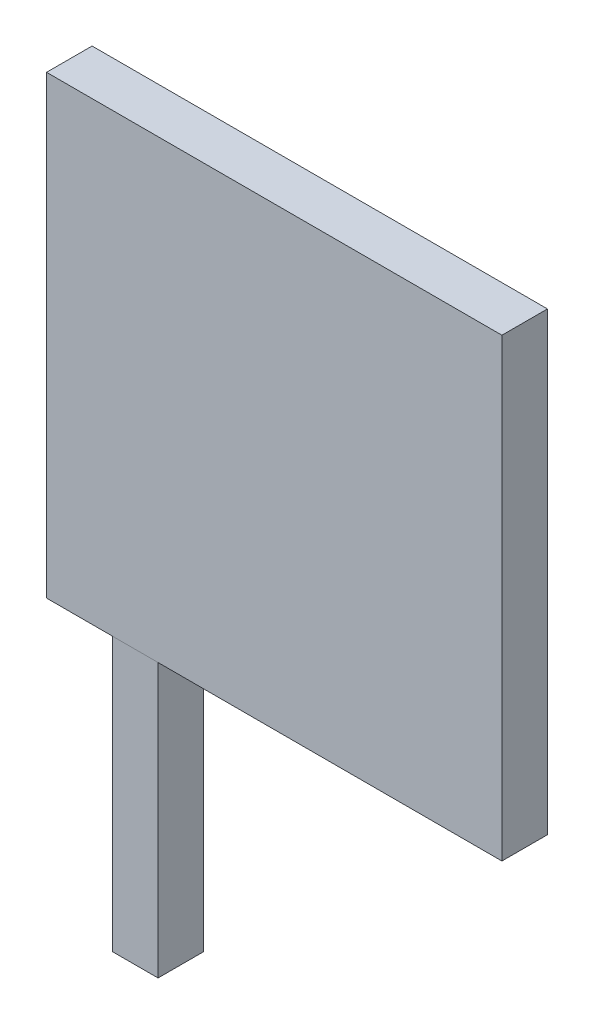
ISO-10303-21;
HEADER;
FILE_DESCRIPTION(('STEP AP214'),'2;1');
FILE_NAME('part.step','',(''),(''),'','','');
FILE_SCHEMA(('AUTOMOTIVE_DESIGN { 1 0 10303 214 1 1 1 1 }'));
ENDSEC;
DATA;
#1=APPLICATION_CONTEXT('core data for automotive mechanical design processes');
#2=APPLICATION_PROTOCOL_DEFINITION('international standard','automotive_design',2000,#1);
#3=PRODUCT_CONTEXT('',#1,'mechanical');
#4=PRODUCT('Part','Part','',(#3));
#5=PRODUCT_RELATED_PRODUCT_CATEGORY('part','',(#4));
#6=PRODUCT_DEFINITION_FORMATION('','',#4);
#7=PRODUCT_DEFINITION_CONTEXT('part definition',#1,'design');
#8=PRODUCT_DEFINITION('design','',#6,#7);
#9=PRODUCT_DEFINITION_SHAPE('','',#8);
#10=(LENGTH_UNIT() NAMED_UNIT(*) SI_UNIT(.MILLI.,.METRE.));
#11=(NAMED_UNIT(*) PLANE_ANGLE_UNIT() SI_UNIT($,.RADIAN.));
#12=(NAMED_UNIT(*) SI_UNIT($,.STERADIAN.) SOLID_ANGLE_UNIT());
#13=UNCERTAINTY_MEASURE_WITH_UNIT(LENGTH_MEASURE(1.E-05),#10,'distance_accuracy_value','');
#14=(GEOMETRIC_REPRESENTATION_CONTEXT(3) GLOBAL_UNCERTAINTY_ASSIGNED_CONTEXT((#13)) GLOBAL_UNIT_ASSIGNED_CONTEXT((#10,
#11,#12)) REPRESENTATION_CONTEXT('',''));
#15=CARTESIAN_POINT('',(0.,0.,0.));
#16=DIRECTION('',(0.,0.,1.));
#17=DIRECTION('',(1.,0.,0.));
#18=AXIS2_PLACEMENT_3D('',#15,#16,#17);
#19=CARTESIAN_POINT('',(-3.5868313545061,-10.4999999999969,0.268683274017871));
#20=DIRECTION('',(1.,0.,0.));
#21=DIRECTION('',(0.,1.,0.));
#22=AXIS2_PLACEMENT_3D('',#19,#20,#21);
#23=PLANE('',#22);
#24=DIRECTION('',(0.,0.,-1.));
#25=VECTOR('',#24,1.);
#26=CARTESIAN_POINT('',(-3.5868313545061,-4.49999999999686,0.268683274017892));
#27=LINE('',#26,#25);
#28=CARTESIAN_POINT('',(-3.5868313545061,-4.49999999999686,0.268683274017892));
#29=VERTEX_POINT('',#28);
#30=CARTESIAN_POINT('',(-3.5868313545061,-4.49999999999685,-0.731316725982108));
#31=VERTEX_POINT('',#30);
#32=EDGE_CURVE('E106',#29,#31,#27,.T.);
#33=ORIENTED_EDGE('',*,*,#32,.T.);
#34=DIRECTION('',(0.,1.,0.));
#35=VECTOR('',#34,1.);
#36=CARTESIAN_POINT('',(-3.5868313545061,-10.4999999999969,-0.731316725982129));
#37=LINE('',#36,#35);
#38=CARTESIAN_POINT('',(-3.5868313545061,-10.4999999999969,-0.731316725982129));
#39=VERTEX_POINT('',#38);
#40=EDGE_CURVE('E12',#39,#31,#37,.T.);
#41=ORIENTED_EDGE('',*,*,#40,.F.);
#42=DIRECTION('',(0.,0.,-1.));
#43=VECTOR('',#42,1.);
#44=CARTESIAN_POINT('',(-3.5868313545061,-10.4999999999969,0.268683274017871));
#45=LINE('',#44,#43);
#46=CARTESIAN_POINT('',(-3.5868313545061,-10.4999999999969,0.268683274017871));
#47=VERTEX_POINT('',#46);
#48=EDGE_CURVE('E94',#47,#39,#45,.T.);
#49=ORIENTED_EDGE('',*,*,#48,.F.);
#50=DIRECTION('',(0.,1.,0.));
#51=VECTOR('',#50,1.);
#52=CARTESIAN_POINT('',(-3.5868313545061,-10.4999999999969,0.268683274017871));
#53=LINE('',#52,#51);
#54=EDGE_CURVE('E102',#47,#29,#53,.T.);
#55=ORIENTED_EDGE('',*,*,#54,.T.);
#56=EDGE_LOOP('',(#33,#41,#49,#55));
#57=FACE_BOUND('',#56,.T.);
#58=ADVANCED_FACE('F43',(#57),#23,.F.);
#59=CARTESIAN_POINT('',(-3.5868313545061,-10.4999999999969,-0.731316725982129));
#60=DIRECTION('',(0.,0.,1.));
#61=DIRECTION('',(0.,-1.,0.));
#62=AXIS2_PLACEMENT_3D('',#59,#60,#61);
#63=PLANE('',#62);
#64=DIRECTION('',(1.,0.,0.));
#65=VECTOR('',#64,1.);
#66=CARTESIAN_POINT('',(-3.5868313545061,-4.49999999999685,-0.731316725982108));
#67=LINE('',#66,#65);
#68=CARTESIAN_POINT('',(-2.5868313545061,-4.49999999999685,-0.731316725982108));
#69=VERTEX_POINT('',#68);
#70=EDGE_CURVE('E98',#31,#69,#67,.T.);
#71=ORIENTED_EDGE('',*,*,#70,.T.);
#72=DIRECTION('',(0.,1.,0.));
#73=VECTOR('',#72,1.);
#74=CARTESIAN_POINT('',(-2.5868313545061,-10.4999999999969,-0.731316725982129));
#75=LINE('',#74,#73);
#76=CARTESIAN_POINT('',(-2.5868313545061,-10.4999999999969,-0.731316725982129));
#77=VERTEX_POINT('',#76);
#78=EDGE_CURVE('E51',#77,#69,#75,.T.);
#79=ORIENTED_EDGE('',*,*,#78,.F.);
#80=DIRECTION('',(1.,0.,0.));
#81=VECTOR('',#80,1.);
#82=CARTESIAN_POINT('',(-3.5868313545061,-10.4999999999969,-0.731316725982129));
#83=LINE('',#82,#81);
#84=EDGE_CURVE('E89',#39,#77,#83,.T.);
#85=ORIENTED_EDGE('',*,*,#84,.F.);
#86=ORIENTED_EDGE('',*,*,#40,.T.);
#87=EDGE_LOOP('',(#71,#79,#85,#86));
#88=FACE_BOUND('',#87,.T.);
#89=ADVANCED_FACE('F97',(#88),#63,.F.);
#90=CARTESIAN_POINT('',(-2.5868313545061,-10.4999999999969,0.268683274017871));
#91=DIRECTION('',(-1.,0.,0.));
#92=DIRECTION('',(0.,-1.,0.));
#93=AXIS2_PLACEMENT_3D('',#90,#91,#92);
#94=PLANE('',#93);
#95=DIRECTION('',(0.,0.,1.));
#96=VECTOR('',#95,1.);
#97=CARTESIAN_POINT('',(-2.5868313545061,-4.49999999999686,0.268683274017892));
#98=LINE('',#97,#96);
#99=CARTESIAN_POINT('',(-2.5868313545061,-4.49999999999686,0.268683274017892));
#100=VERTEX_POINT('',#99);
#101=EDGE_CURVE('E76',#69,#100,#98,.T.);
#102=ORIENTED_EDGE('',*,*,#101,.T.);
#103=DIRECTION('',(0.,1.,0.));
#104=VECTOR('',#103,1.);
#105=CARTESIAN_POINT('',(-2.5868313545061,-10.4999999999969,0.268683274017871));
#106=LINE('',#105,#104);
#107=CARTESIAN_POINT('',(-2.5868313545061,-10.4999999999969,0.268683274017871));
#108=VERTEX_POINT('',#107);
#109=EDGE_CURVE('E99',#108,#100,#106,.T.);
#110=ORIENTED_EDGE('',*,*,#109,.F.);
#111=DIRECTION('',(0.,0.,1.));
#112=VECTOR('',#111,1.);
#113=CARTESIAN_POINT('',(-2.5868313545061,-10.4999999999969,0.268683274017871));
#114=LINE('',#113,#112);
#115=EDGE_CURVE('E92',#77,#108,#114,.T.);
#116=ORIENTED_EDGE('',*,*,#115,.F.);
#117=ORIENTED_EDGE('',*,*,#78,.T.);
#118=EDGE_LOOP('',(#102,#110,#116,#117));
#119=FACE_BOUND('',#118,.T.);
#120=ADVANCED_FACE('F100',(#119),#94,.F.);
#121=CARTESIAN_POINT('',(-3.5868313545061,-10.4999999999969,0.268683274017871));
#122=DIRECTION('',(0.,0.,-1.));
#123=DIRECTION('',(0.,1.,0.));
#124=AXIS2_PLACEMENT_3D('',#121,#122,#123);
#125=PLANE('',#124);
#126=DIRECTION('',(-1.,0.,0.));
#127=VECTOR('',#126,1.);
#128=CARTESIAN_POINT('',(-3.5868313545061,-4.49999999999686,0.268683274017892));
#129=LINE('',#128,#127);
#130=EDGE_CURVE('E82',#100,#29,#129,.T.);
#131=ORIENTED_EDGE('',*,*,#130,.T.);
#132=ORIENTED_EDGE('',*,*,#54,.F.);
#133=DIRECTION('',(-1.,0.,0.));
#134=VECTOR('',#133,1.);
#135=CARTESIAN_POINT('',(-3.5868313545061,-10.4999999999969,0.268683274017871));
#136=LINE('',#135,#134);
#137=EDGE_CURVE('E59',#108,#47,#136,.T.);
#138=ORIENTED_EDGE('',*,*,#137,.F.);
#139=ORIENTED_EDGE('',*,*,#109,.T.);
#140=EDGE_LOOP('',(#131,#132,#138,#139));
#141=FACE_BOUND('',#140,.T.);
#142=ADVANCED_FACE('F113',(#141),#125,.F.);
#143=CARTESIAN_POINT('',(0.,-10.4999999999969,-0.731316725982129));
#144=DIRECTION('',(0.,-1.,0.));
#145=DIRECTION('',(1.,0.,0.));
#146=AXIS2_PLACEMENT_3D('',#143,#144,#145);
#147=PLANE('',#146);
#148=ORIENTED_EDGE('',*,*,#48,.T.);
#149=ORIENTED_EDGE('',*,*,#84,.T.);
#150=ORIENTED_EDGE('',*,*,#115,.T.);
#151=ORIENTED_EDGE('',*,*,#137,.T.);
#152=EDGE_LOOP('',(#148,#149,#150,#151));
#153=FACE_BOUND('',#152,.T.);
#154=ADVANCED_FACE('F90',(#153),#147,.T.);
#155=CARTESIAN_POINT('',(0.,-4.49999999999685,-0.731316725982108));
#156=DIRECTION('',(0.,-1.,0.));
#157=DIRECTION('',(1.,0.,0.));
#158=AXIS2_PLACEMENT_3D('',#155,#156,#157);
#159=PLANE('',#158);
#160=ORIENTED_EDGE('',*,*,#32,.F.);
#161=ORIENTED_EDGE('',*,*,#130,.F.);
#162=ORIENTED_EDGE('',*,*,#101,.F.);
#163=ORIENTED_EDGE('',*,*,#70,.F.);
#164=EDGE_LOOP('',(#160,#161,#162,#163));
#165=FACE_BOUND('',#164,.T.);
#166=ADVANCED_FACE('F116',(#165),#159,.F.);
#167=CLOSED_SHELL('',(#58,#89,#120,#142,#154,#166));
#168=MANIFOLD_SOLID_BREP('B2',#167);
#169=CARTESIAN_POINT('',(-5.0355871886121,5.4999999999998,0.268683274023395));
#170=DIRECTION('',(1.,0.,0.));
#171=DIRECTION('',(0.,1.,4.08506561910826E-13));
#172=AXIS2_PLACEMENT_3D('',#169,#170,#171);
#173=PLANE('',#172);
#174=DIRECTION('',(0.,-1.,-4.08506561910826E-13));
#175=VECTOR('',#174,1.);
#176=CARTESIAN_POINT('',(-5.0355871886121,5.50000000000021,-0.731316725976605));
#177=LINE('',#176,#175);
#178=CARTESIAN_POINT('',(-5.0355871886121,5.50000000000021,-0.731316725976605));
#179=VERTEX_POINT('',#178);
#180=CARTESIAN_POINT('',(-5.0355871886121,-4.4999999999998,-0.73131672598069));
#181=VERTEX_POINT('',#180);
#182=EDGE_CURVE('E229',#179,#181,#177,.T.);
#183=ORIENTED_EDGE('',*,*,#182,.T.);
#184=DIRECTION('',(0.,4.08506561910826E-13,-1.));
#185=VECTOR('',#184,1.);
#186=CARTESIAN_POINT('',(-5.0355871886121,-4.50000000000021,0.26868327401931));
#187=LINE('',#186,#185);
#188=CARTESIAN_POINT('',(-5.0355871886121,-4.50000000000021,0.26868327401931));
#189=VERTEX_POINT('',#188);
#190=EDGE_CURVE('E41',#189,#181,#187,.T.);
#191=ORIENTED_EDGE('',*,*,#190,.F.);
#192=DIRECTION('',(0.,-1.,-4.08506561910826E-13));
#193=VECTOR('',#192,1.);
#194=CARTESIAN_POINT('',(-5.0355871886121,5.4999999999998,0.268683274023395));
#195=LINE('',#194,#193);
#196=CARTESIAN_POINT('',(-5.0355871886121,5.4999999999998,0.268683274023395));
#197=VERTEX_POINT('',#196);
#198=EDGE_CURVE('E217',#197,#189,#195,.T.);
#199=ORIENTED_EDGE('',*,*,#198,.F.);
#200=DIRECTION('',(0.,4.08506561910826E-13,-1.));
#201=VECTOR('',#200,1.);
#202=CARTESIAN_POINT('',(-5.0355871886121,5.4999999999998,0.268683274023395));
#203=LINE('',#202,#201);
#204=EDGE_CURVE('E225',#197,#179,#203,.T.);
#205=ORIENTED_EDGE('',*,*,#204,.T.);
#206=EDGE_LOOP('',(#183,#191,#199,#205));
#207=FACE_BOUND('',#206,.T.);
#208=ADVANCED_FACE('F166',(#207),#173,.F.);
#209=CARTESIAN_POINT('',(-5.0355871886121,-4.50000000000021,0.26868327401931));
#210=DIRECTION('',(0.,1.,4.08506561910826E-13));
#211=DIRECTION('',(-1.,0.,0.));
#212=AXIS2_PLACEMENT_3D('',#209,#210,#211);
#213=PLANE('',#212);
#214=DIRECTION('',(1.,0.,0.));
#215=VECTOR('',#214,1.);
#216=CARTESIAN_POINT('',(-5.0355871886121,-4.4999999999998,-0.73131672598069));
#217=LINE('',#216,#215);
#218=CARTESIAN_POINT('',(4.9644128113879,-4.4999999999998,-0.73131672598069));
#219=VERTEX_POINT('',#218);
#220=EDGE_CURVE('E221',#181,#219,#217,.T.);
#221=ORIENTED_EDGE('',*,*,#220,.T.);
#222=DIRECTION('',(0.,4.08506561910826E-13,-1.));
#223=VECTOR('',#222,1.);
#224=CARTESIAN_POINT('',(4.9644128113879,-4.50000000000021,0.26868327401931));
#225=LINE('',#224,#223);
#226=CARTESIAN_POINT('',(4.9644128113879,-4.50000000000021,0.26868327401931));
#227=VERTEX_POINT('',#226);
#228=EDGE_CURVE('E174',#227,#219,#225,.T.);
#229=ORIENTED_EDGE('',*,*,#228,.F.);
#230=DIRECTION('',(1.,0.,0.));
#231=VECTOR('',#230,1.);
#232=CARTESIAN_POINT('',(-5.0355871886121,-4.50000000000021,0.26868327401931));
#233=LINE('',#232,#231);
#234=EDGE_CURVE('E212',#189,#227,#233,.T.);
#235=ORIENTED_EDGE('',*,*,#234,.F.);
#236=ORIENTED_EDGE('',*,*,#190,.T.);
#237=EDGE_LOOP('',(#221,#229,#235,#236));
#238=FACE_BOUND('',#237,.T.);
#239=ADVANCED_FACE('F220',(#238),#213,.F.);
#240=CARTESIAN_POINT('',(4.9644128113879,5.4999999999998,0.268683274023395));
#241=DIRECTION('',(-1.,0.,0.));
#242=DIRECTION('',(0.,-1.,-4.08506561910826E-13));
#243=AXIS2_PLACEMENT_3D('',#240,#241,#242);
#244=PLANE('',#243);
#245=DIRECTION('',(0.,1.,4.08506561910826E-13));
#246=VECTOR('',#245,1.);
#247=CARTESIAN_POINT('',(4.9644128113879,5.50000000000021,-0.731316725976605));
#248=LINE('',#247,#246);
#249=CARTESIAN_POINT('',(4.9644128113879,5.50000000000021,-0.731316725976605));
#250=VERTEX_POINT('',#249);
#251=EDGE_CURVE('E199',#219,#250,#248,.T.);
#252=ORIENTED_EDGE('',*,*,#251,.T.);
#253=DIRECTION('',(0.,4.08506561910826E-13,-1.));
#254=VECTOR('',#253,1.);
#255=CARTESIAN_POINT('',(4.9644128113879,5.4999999999998,0.268683274023395));
#256=LINE('',#255,#254);
#257=CARTESIAN_POINT('',(4.9644128113879,5.4999999999998,0.268683274023395));
#258=VERTEX_POINT('',#257);
#259=EDGE_CURVE('E222',#258,#250,#256,.T.);
#260=ORIENTED_EDGE('',*,*,#259,.F.);
#261=DIRECTION('',(0.,1.,4.08506561910826E-13));
#262=VECTOR('',#261,1.);
#263=CARTESIAN_POINT('',(4.9644128113879,5.4999999999998,0.268683274023395));
#264=LINE('',#263,#262);
#265=EDGE_CURVE('E215',#227,#258,#264,.T.);
#266=ORIENTED_EDGE('',*,*,#265,.F.);
#267=ORIENTED_EDGE('',*,*,#228,.T.);
#268=EDGE_LOOP('',(#252,#260,#266,#267));
#269=FACE_BOUND('',#268,.T.);
#270=ADVANCED_FACE('F223',(#269),#244,.F.);
#271=CARTESIAN_POINT('',(-5.0355871886121,5.4999999999998,0.268683274023395));
#272=DIRECTION('',(0.,-1.,-4.08506561910826E-13));
#273=DIRECTION('',(1.,0.,0.));
#274=AXIS2_PLACEMENT_3D('',#271,#272,#273);
#275=PLANE('',#274);
#276=DIRECTION('',(-1.,0.,0.));
#277=VECTOR('',#276,1.);
#278=CARTESIAN_POINT('',(-5.0355871886121,5.50000000000021,-0.731316725976605));
#279=LINE('',#278,#277);
#280=EDGE_CURVE('E205',#250,#179,#279,.T.);
#281=ORIENTED_EDGE('',*,*,#280,.T.);
#282=ORIENTED_EDGE('',*,*,#204,.F.);
#283=DIRECTION('',(-1.,0.,0.));
#284=VECTOR('',#283,1.);
#285=CARTESIAN_POINT('',(-5.0355871886121,5.4999999999998,0.268683274023395));
#286=LINE('',#285,#284);
#287=EDGE_CURVE('E182',#258,#197,#286,.T.);
#288=ORIENTED_EDGE('',*,*,#287,.F.);
#289=ORIENTED_EDGE('',*,*,#259,.T.);
#290=EDGE_LOOP('',(#281,#282,#288,#289));
#291=FACE_BOUND('',#290,.T.);
#292=ADVANCED_FACE('F236',(#291),#275,.F.);
#293=CARTESIAN_POINT('',(0.,0.268683274021148,0.268683274021258));
#294=DIRECTION('',(0.,-4.08506561910826E-13,1.));
#295=DIRECTION('',(0.,-1.,-4.08506561910826E-13));
#296=AXIS2_PLACEMENT_3D('',#293,#294,#295);
#297=PLANE('',#296);
#298=ORIENTED_EDGE('',*,*,#198,.T.);
#299=ORIENTED_EDGE('',*,*,#234,.T.);
#300=ORIENTED_EDGE('',*,*,#265,.T.);
#301=ORIENTED_EDGE('',*,*,#287,.T.);
#302=EDGE_LOOP('',(#298,#299,#300,#301));
#303=FACE_BOUND('',#302,.T.);
#304=ADVANCED_FACE('F213',(#303),#297,.T.);
#305=CARTESIAN_POINT('',(0.,0.268683274021557,-0.731316725978742));
#306=DIRECTION('',(0.,-4.08506561910826E-13,1.));
#307=DIRECTION('',(0.,-1.,-4.08506561910826E-13));
#308=AXIS2_PLACEMENT_3D('',#305,#306,#307);
#309=PLANE('',#308);
#310=ORIENTED_EDGE('',*,*,#182,.F.);
#311=ORIENTED_EDGE('',*,*,#280,.F.);
#312=ORIENTED_EDGE('',*,*,#251,.F.);
#313=ORIENTED_EDGE('',*,*,#220,.F.);
#314=EDGE_LOOP('',(#310,#311,#312,#313));
#315=FACE_BOUND('',#314,.T.);
#316=ADVANCED_FACE('F239',(#315),#309,.F.);
#317=CLOSED_SHELL('',(#208,#239,#270,#292,#304,#316));
#318=MANIFOLD_SOLID_BREP('B6',#317);
#319=ADVANCED_BREP_SHAPE_REPRESENTATION('',(#18,#168,#318),#14);
#320=SHAPE_DEFINITION_REPRESENTATION(#9,#319);
ENDSEC;
END-ISO-10303-21;
